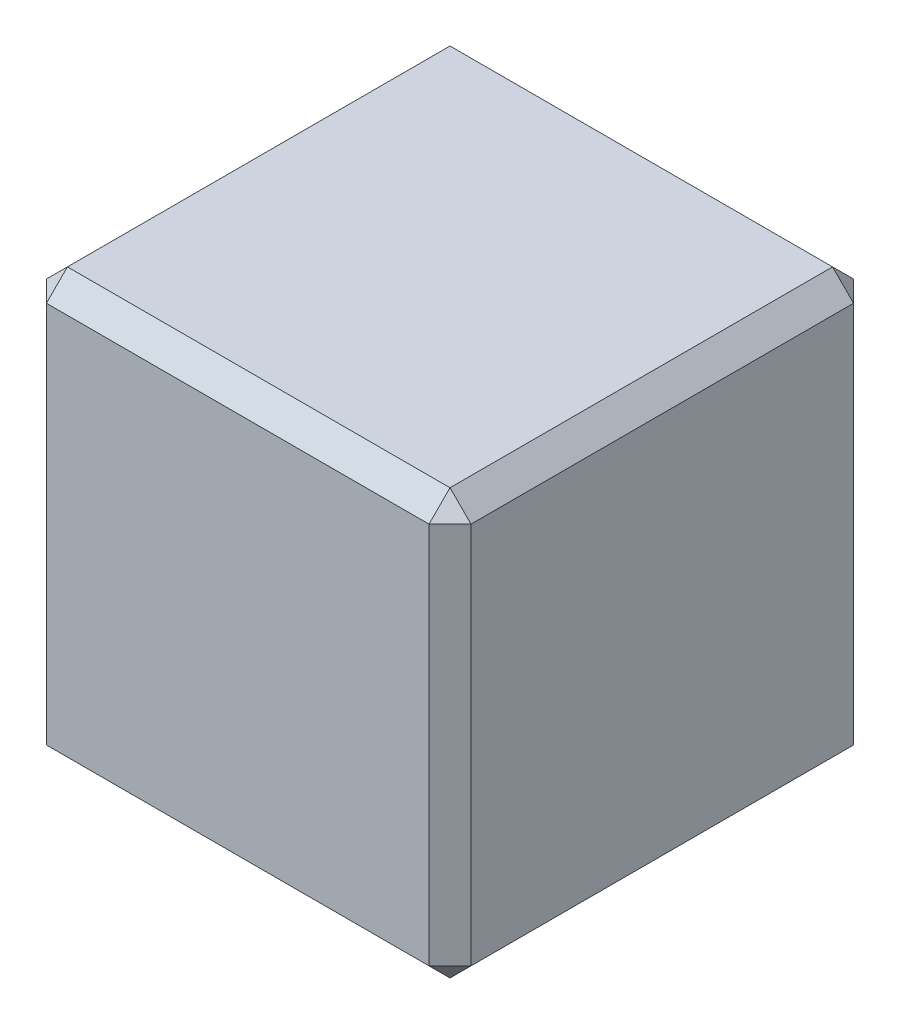
ISO-10303-21;
HEADER;
FILE_DESCRIPTION(('STEP AP214'),'2;1');
FILE_NAME('part.step','',(''),(''),'','','');
FILE_SCHEMA(('AUTOMOTIVE_DESIGN { 1 0 10303 214 1 1 1 1 }'));
ENDSEC;
DATA;
#1=APPLICATION_CONTEXT('core data for automotive mechanical design processes');
#2=APPLICATION_PROTOCOL_DEFINITION('international standard','automotive_design',2000,#1);
#3=PRODUCT_CONTEXT('',#1,'mechanical');
#4=PRODUCT('Part','Part','',(#3));
#5=PRODUCT_RELATED_PRODUCT_CATEGORY('part','',(#4));
#6=PRODUCT_DEFINITION_FORMATION('','',#4);
#7=PRODUCT_DEFINITION_CONTEXT('part definition',#1,'design');
#8=PRODUCT_DEFINITION('design','',#6,#7);
#9=PRODUCT_DEFINITION_SHAPE('','',#8);
#10=(LENGTH_UNIT() NAMED_UNIT(*) SI_UNIT(.MILLI.,.METRE.));
#11=(NAMED_UNIT(*) PLANE_ANGLE_UNIT() SI_UNIT($,.RADIAN.));
#12=(NAMED_UNIT(*) SI_UNIT($,.STERADIAN.) SOLID_ANGLE_UNIT());
#13=UNCERTAINTY_MEASURE_WITH_UNIT(LENGTH_MEASURE(1.E-05),#10,'distance_accuracy_value','');
#14=(GEOMETRIC_REPRESENTATION_CONTEXT(3) GLOBAL_UNCERTAINTY_ASSIGNED_CONTEXT((#13)) GLOBAL_UNIT_ASSIGNED_CONTEXT((#10,
#11,#12)) REPRESENTATION_CONTEXT('',''));
#15=CARTESIAN_POINT('',(0.,0.,0.));
#16=DIRECTION('',(0.,0.,1.));
#17=DIRECTION('',(1.,0.,0.));
#18=AXIS2_PLACEMENT_3D('',#15,#16,#17);
#19=CARTESIAN_POINT('',(50.54,101.08,-50.54));
#20=DIRECTION('',(-1.,0.,0.));
#21=DIRECTION('',(0.,0.,1.));
#22=AXIS2_PLACEMENT_3D('',#19,#20,#21);
#23=PLANE('',#22);
#24=DIRECTION('',(0.,-1.,0.));
#25=VECTOR('',#24,1.);
#26=CARTESIAN_POINT('',(50.54,101.08,45.54));
#27=LINE('',#26,#25);
#28=CARTESIAN_POINT('',(50.54,96.08,45.54));
#29=VERTEX_POINT('',#28);
#30=CARTESIAN_POINT('',(50.54,4.99999999999999,45.54));
#31=VERTEX_POINT('',#30);
#32=EDGE_CURVE('E128',#29,#31,#27,.T.);
#33=ORIENTED_EDGE('',*,*,#32,.T.);
#34=DIRECTION('',(0.,0.,-1.));
#35=VECTOR('',#34,1.);
#36=CARTESIAN_POINT('',(50.54,4.99999999999999,-50.54));
#37=LINE('',#36,#35);
#38=CARTESIAN_POINT('',(50.54,4.99999999999999,-45.54));
#39=VERTEX_POINT('',#38);
#40=EDGE_CURVE('E165',#31,#39,#37,.T.);
#41=ORIENTED_EDGE('',*,*,#40,.T.);
#42=DIRECTION('',(0.,1.,0.));
#43=VECTOR('',#42,1.);
#44=CARTESIAN_POINT('',(50.54,101.08,-45.54));
#45=LINE('',#44,#43);
#46=CARTESIAN_POINT('',(50.54,96.08,-45.54));
#47=VERTEX_POINT('',#46);
#48=EDGE_CURVE('E131',#39,#47,#45,.T.);
#49=ORIENTED_EDGE('',*,*,#48,.T.);
#50=DIRECTION('',(0.,0.,1.));
#51=VECTOR('',#50,1.);
#52=CARTESIAN_POINT('',(50.54,96.08,50.54));
#53=LINE('',#52,#51);
#54=EDGE_CURVE('E124',#47,#29,#53,.T.);
#55=ORIENTED_EDGE('',*,*,#54,.T.);
#56=EDGE_LOOP('',(#33,#41,#49,#55));
#57=FACE_BOUND('',#56,.T.);
#58=ADVANCED_FACE('F37',(#57),#23,.F.);
#59=CARTESIAN_POINT('',(-50.54,101.08,-50.54));
#60=DIRECTION('',(0.,0.,1.));
#61=DIRECTION('',(1.,0.,0.));
#62=AXIS2_PLACEMENT_3D('',#59,#60,#61);
#63=PLANE('',#62);
#64=DIRECTION('',(1.,0.,0.));
#65=VECTOR('',#64,1.);
#66=CARTESIAN_POINT('',(50.54,96.08,-50.54));
#67=LINE('',#66,#65);
#68=CARTESIAN_POINT('',(-45.54,96.08,-50.54));
#69=VERTEX_POINT('',#68);
#70=CARTESIAN_POINT('',(45.54,96.08,-50.54));
#71=VERTEX_POINT('',#70);
#72=EDGE_CURVE('E178',#69,#71,#67,.T.);
#73=ORIENTED_EDGE('',*,*,#72,.T.);
#74=DIRECTION('',(0.,-1.,0.));
#75=VECTOR('',#74,1.);
#76=CARTESIAN_POINT('',(45.54,101.08,-50.54));
#77=LINE('',#76,#75);
#78=CARTESIAN_POINT('',(45.54,4.99999999999999,-50.54));
#79=VERTEX_POINT('',#78);
#80=EDGE_CURVE('E182',#71,#79,#77,.T.);
#81=ORIENTED_EDGE('',*,*,#80,.T.);
#82=DIRECTION('',(-1.,0.,0.));
#83=VECTOR('',#82,1.);
#84=CARTESIAN_POINT('',(-50.54,4.99999999999999,-50.54));
#85=LINE('',#84,#83);
#86=CARTESIAN_POINT('',(-45.54,4.99999999999999,-50.54));
#87=VERTEX_POINT('',#86);
#88=EDGE_CURVE('E180',#79,#87,#85,.T.);
#89=ORIENTED_EDGE('',*,*,#88,.T.);
#90=DIRECTION('',(0.,1.,0.));
#91=VECTOR('',#90,1.);
#92=CARTESIAN_POINT('',(-45.54,101.08,-50.54));
#93=LINE('',#92,#91);
#94=EDGE_CURVE('E176',#87,#69,#93,.T.);
#95=ORIENTED_EDGE('',*,*,#94,.T.);
#96=EDGE_LOOP('',(#73,#81,#89,#95));
#97=FACE_BOUND('',#96,.T.);
#98=ADVANCED_FACE('F278',(#97),#63,.F.);
#99=CARTESIAN_POINT('',(-50.54,101.08,-50.54));
#100=DIRECTION('',(1.,0.,0.));
#101=DIRECTION('',(0.,0.,-1.));
#102=AXIS2_PLACEMENT_3D('',#99,#100,#101);
#103=PLANE('',#102);
#104=DIRECTION('',(0.,0.,-1.));
#105=VECTOR('',#104,1.);
#106=CARTESIAN_POINT('',(-50.54,96.08,-50.54));
#107=LINE('',#106,#105);
#108=CARTESIAN_POINT('',(-50.54,96.08,45.54));
#109=VERTEX_POINT('',#108);
#110=CARTESIAN_POINT('',(-50.54,96.08,-45.54));
#111=VERTEX_POINT('',#110);
#112=EDGE_CURVE('E46',#109,#111,#107,.T.);
#113=ORIENTED_EDGE('',*,*,#112,.T.);
#114=DIRECTION('',(0.,-1.,0.));
#115=VECTOR('',#114,1.);
#116=CARTESIAN_POINT('',(-50.54,101.08,-45.54));
#117=LINE('',#116,#115);
#118=CARTESIAN_POINT('',(-50.54,4.99999999999999,-45.54));
#119=VERTEX_POINT('',#118);
#120=EDGE_CURVE('E11',#111,#119,#117,.T.);
#121=ORIENTED_EDGE('',*,*,#120,.T.);
#122=DIRECTION('',(0.,0.,1.));
#123=VECTOR('',#122,1.);
#124=CARTESIAN_POINT('',(-50.54,4.99999999999999,-50.54));
#125=LINE('',#124,#123);
#126=CARTESIAN_POINT('',(-50.54,4.99999999999999,45.54));
#127=VERTEX_POINT('',#126);
#128=EDGE_CURVE('E202',#119,#127,#125,.T.);
#129=ORIENTED_EDGE('',*,*,#128,.T.);
#130=DIRECTION('',(0.,1.,0.));
#131=VECTOR('',#130,1.);
#132=CARTESIAN_POINT('',(-50.54,101.08,45.54));
#133=LINE('',#132,#131);
#134=EDGE_CURVE('E57',#127,#109,#133,.T.);
#135=ORIENTED_EDGE('',*,*,#134,.T.);
#136=EDGE_LOOP('',(#113,#121,#129,#135));
#137=FACE_BOUND('',#136,.T.);
#138=ADVANCED_FACE('F284',(#137),#103,.F.);
#139=CARTESIAN_POINT('',(-50.54,101.08,50.54));
#140=DIRECTION('',(0.,0.,-1.));
#141=DIRECTION('',(-1.,0.,0.));
#142=AXIS2_PLACEMENT_3D('',#139,#140,#141);
#143=PLANE('',#142);
#144=DIRECTION('',(0.,1.,0.));
#145=VECTOR('',#144,1.);
#146=CARTESIAN_POINT('',(45.54,101.08,50.54));
#147=LINE('',#146,#145);
#148=CARTESIAN_POINT('',(45.54,4.99999999999999,50.54));
#149=VERTEX_POINT('',#148);
#150=CARTESIAN_POINT('',(45.54,96.08,50.54));
#151=VERTEX_POINT('',#150);
#152=EDGE_CURVE('E197',#149,#151,#147,.T.);
#153=ORIENTED_EDGE('',*,*,#152,.T.);
#154=DIRECTION('',(-1.,0.,0.));
#155=VECTOR('',#154,1.);
#156=CARTESIAN_POINT('',(-50.54,96.08,50.54));
#157=LINE('',#156,#155);
#158=CARTESIAN_POINT('',(-45.54,96.08,50.54));
#159=VERTEX_POINT('',#158);
#160=EDGE_CURVE('E199',#151,#159,#157,.T.);
#161=ORIENTED_EDGE('',*,*,#160,.T.);
#162=DIRECTION('',(0.,-1.,0.));
#163=VECTOR('',#162,1.);
#164=CARTESIAN_POINT('',(-45.54,101.08,50.54));
#165=LINE('',#164,#163);
#166=CARTESIAN_POINT('',(-45.54,4.99999999999999,50.54));
#167=VERTEX_POINT('',#166);
#168=EDGE_CURVE('E193',#159,#167,#165,.T.);
#169=ORIENTED_EDGE('',*,*,#168,.T.);
#170=DIRECTION('',(1.,0.,0.));
#171=VECTOR('',#170,1.);
#172=CARTESIAN_POINT('',(-50.54,4.99999999999999,50.54));
#173=LINE('',#172,#171);
#174=EDGE_CURVE('E195',#167,#149,#173,.T.);
#175=ORIENTED_EDGE('',*,*,#174,.T.);
#176=EDGE_LOOP('',(#153,#161,#169,#175));
#177=FACE_BOUND('',#176,.T.);
#178=ADVANCED_FACE('F303',(#177),#143,.F.);
#179=CARTESIAN_POINT('',(0.,101.08,0.));
#180=DIRECTION('',(0.,1.,0.));
#181=DIRECTION('',(0.,0.,1.));
#182=AXIS2_PLACEMENT_3D('',#179,#180,#181);
#183=PLANE('',#182);
#184=DIRECTION('',(0.,0.,-1.));
#185=VECTOR('',#184,1.);
#186=CARTESIAN_POINT('',(45.54,101.08,-50.54));
#187=LINE('',#186,#185);
#188=CARTESIAN_POINT('',(45.54,101.08,45.54));
#189=VERTEX_POINT('',#188);
#190=CARTESIAN_POINT('',(45.54,101.08,-45.54));
#191=VERTEX_POINT('',#190);
#192=EDGE_CURVE('E141',#189,#191,#187,.T.);
#193=ORIENTED_EDGE('',*,*,#192,.T.);
#194=DIRECTION('',(-1.,0.,0.));
#195=VECTOR('',#194,1.);
#196=CARTESIAN_POINT('',(-50.54,101.08,-45.54));
#197=LINE('',#196,#195);
#198=CARTESIAN_POINT('',(-45.54,101.08,-45.54));
#199=VERTEX_POINT('',#198);
#200=EDGE_CURVE('E190',#191,#199,#197,.T.);
#201=ORIENTED_EDGE('',*,*,#200,.T.);
#202=DIRECTION('',(0.,0.,1.));
#203=VECTOR('',#202,1.);
#204=CARTESIAN_POINT('',(-45.54,101.08,50.54));
#205=LINE('',#204,#203);
#206=CARTESIAN_POINT('',(-45.54,101.08,45.54));
#207=VERTEX_POINT('',#206);
#208=EDGE_CURVE('E185',#199,#207,#205,.T.);
#209=ORIENTED_EDGE('',*,*,#208,.T.);
#210=DIRECTION('',(1.,0.,0.));
#211=VECTOR('',#210,1.);
#212=CARTESIAN_POINT('',(50.54,101.08,45.54));
#213=LINE('',#212,#211);
#214=EDGE_CURVE('E187',#207,#189,#213,.T.);
#215=ORIENTED_EDGE('',*,*,#214,.T.);
#216=EDGE_LOOP('',(#193,#201,#209,#215));
#217=FACE_BOUND('',#216,.T.);
#218=ADVANCED_FACE('F265',(#217),#183,.T.);
#219=CARTESIAN_POINT('',(0.,0.,0.));
#220=DIRECTION('',(0.,1.,0.));
#221=DIRECTION('',(0.,0.,1.));
#222=AXIS2_PLACEMENT_3D('',#219,#220,#221);
#223=PLANE('',#222);
#224=DIRECTION('',(1.,0.,0.));
#225=VECTOR('',#224,1.);
#226=CARTESIAN_POINT('',(0.,0.,-45.54));
#227=LINE('',#226,#225);
#228=CARTESIAN_POINT('',(-45.54,0.,-45.54));
#229=VERTEX_POINT('',#228);
#230=CARTESIAN_POINT('',(45.54,0.,-45.54));
#231=VERTEX_POINT('',#230);
#232=EDGE_CURVE('E171',#229,#231,#227,.T.);
#233=ORIENTED_EDGE('',*,*,#232,.T.);
#234=DIRECTION('',(0.,0.,1.));
#235=VECTOR('',#234,1.);
#236=CARTESIAN_POINT('',(45.54,0.,0.));
#237=LINE('',#236,#235);
#238=CARTESIAN_POINT('',(45.54,0.,45.54));
#239=VERTEX_POINT('',#238);
#240=EDGE_CURVE('E173',#231,#239,#237,.T.);
#241=ORIENTED_EDGE('',*,*,#240,.T.);
#242=DIRECTION('',(-1.,0.,0.));
#243=VECTOR('',#242,1.);
#244=CARTESIAN_POINT('',(0.,0.,45.54));
#245=LINE('',#244,#243);
#246=CARTESIAN_POINT('',(-45.54,0.,45.54));
#247=VERTEX_POINT('',#246);
#248=EDGE_CURVE('E169',#239,#247,#245,.T.);
#249=ORIENTED_EDGE('',*,*,#248,.T.);
#250=DIRECTION('',(0.,0.,-1.));
#251=VECTOR('',#250,1.);
#252=CARTESIAN_POINT('',(-45.54,0.,0.));
#253=LINE('',#252,#251);
#254=EDGE_CURVE('E167',#247,#229,#253,.T.);
#255=ORIENTED_EDGE('',*,*,#254,.T.);
#256=EDGE_LOOP('',(#233,#241,#249,#255));
#257=FACE_BOUND('',#256,.T.);
#258=ADVANCED_FACE('F481',(#257),#223,.F.);
#259=CARTESIAN_POINT('',(-45.54,101.08,0.));
#260=DIRECTION('',(-0.707106781186546,0.707106781186548,0.));
#261=DIRECTION('',(0.,0.,-1.));
#262=AXIS2_PLACEMENT_3D('',#259,#260,#261);
#263=PLANE('',#262);
#264=DIRECTION('',(-0.707106781186548,-0.707106781186546,0.));
#265=VECTOR('',#264,1.);
#266=CARTESIAN_POINT('',(-48.04,98.58,45.54));
#267=LINE('',#266,#265);
#268=EDGE_CURVE('E41',#207,#109,#267,.T.);
#269=ORIENTED_EDGE('',*,*,#268,.F.);
#270=ORIENTED_EDGE('',*,*,#208,.F.);
#271=DIRECTION('',(0.707106781186548,0.707106781186546,0.));
#272=VECTOR('',#271,1.);
#273=CARTESIAN_POINT('',(-45.54,101.08,-45.54));
#274=LINE('',#273,#272);
#275=EDGE_CURVE('E162',#111,#199,#274,.T.);
#276=ORIENTED_EDGE('',*,*,#275,.F.);
#277=ORIENTED_EDGE('',*,*,#112,.F.);
#278=EDGE_LOOP('',(#269,#270,#276,#277));
#279=FACE_BOUND('',#278,.T.);
#280=ADVANCED_FACE('F39',(#279),#263,.T.);
#281=CARTESIAN_POINT('',(-45.54,96.08,50.54));
#282=DIRECTION('',(-0.577350269189624,0.577350269189626,0.577350269189627));
#283=DIRECTION('',(0.,-0.707106781186548,0.707106781186547));
#284=AXIS2_PLACEMENT_3D('',#281,#282,#283);
#285=PLANE('',#284);
#286=DIRECTION('',(0.,0.707106781186548,-0.707106781186546));
#287=VECTOR('',#286,1.);
#288=CARTESIAN_POINT('',(-45.54,96.08,50.54));
#289=LINE('',#288,#287);
#290=EDGE_CURVE('E247',#207,#159,#289,.F.);
#291=ORIENTED_EDGE('',*,*,#290,.F.);
#292=ORIENTED_EDGE('',*,*,#268,.T.);
#293=DIRECTION('',(-0.707106781186548,0.,-0.707106781186546));
#294=VECTOR('',#293,1.);
#295=CARTESIAN_POINT('',(-45.54,96.08,50.54));
#296=LINE('',#295,#294);
#297=EDGE_CURVE('E250',#159,#109,#296,.T.);
#298=ORIENTED_EDGE('',*,*,#297,.F.);
#299=EDGE_LOOP('',(#291,#292,#298));
#300=FACE_BOUND('',#299,.T.);
#301=ADVANCED_FACE('F306',(#300),#285,.T.);
#302=CARTESIAN_POINT('',(-45.54,101.08,-45.54));
#303=DIRECTION('',(-0.577350269189624,0.577350269189626,-0.577350269189627));
#304=DIRECTION('',(0.,0.707106781186548,0.707106781186547));
#305=AXIS2_PLACEMENT_3D('',#302,#303,#304);
#306=PLANE('',#305);
#307=DIRECTION('',(0.707106781186548,0.,-0.707106781186546));
#308=VECTOR('',#307,1.);
#309=CARTESIAN_POINT('',(-48.04,96.08,-48.04));
#310=LINE('',#309,#308);
#311=EDGE_CURVE('E242',#111,#69,#310,.T.);
#312=ORIENTED_EDGE('',*,*,#311,.F.);
#313=ORIENTED_EDGE('',*,*,#275,.T.);
#314=DIRECTION('',(0.,-0.707106781186548,-0.707106781186546));
#315=VECTOR('',#314,1.);
#316=CARTESIAN_POINT('',(-45.54,101.08,-45.54));
#317=LINE('',#316,#315);
#318=EDGE_CURVE('E245',#69,#199,#317,.F.);
#319=ORIENTED_EDGE('',*,*,#318,.F.);
#320=EDGE_LOOP('',(#312,#313,#319));
#321=FACE_BOUND('',#320,.T.);
#322=ADVANCED_FACE('F257',(#321),#306,.T.);
#323=CARTESIAN_POINT('',(-45.54,101.08,50.54));
#324=DIRECTION('',(0.707106781186546,0.,-0.707106781186548));
#325=DIRECTION('',(0.,-1.,0.));
#326=AXIS2_PLACEMENT_3D('',#323,#324,#325);
#327=PLANE('',#326);
#328=ORIENTED_EDGE('',*,*,#297,.T.);
#329=ORIENTED_EDGE('',*,*,#134,.F.);
#330=DIRECTION('',(0.707106781186548,0.,0.707106781186546));
#331=VECTOR('',#330,1.);
#332=CARTESIAN_POINT('',(-48.04,4.99999999999999,48.04));
#333=LINE('',#332,#331);
#334=EDGE_CURVE('E236',#167,#127,#333,.F.);
#335=ORIENTED_EDGE('',*,*,#334,.F.);
#336=ORIENTED_EDGE('',*,*,#168,.F.);
#337=EDGE_LOOP('',(#328,#329,#335,#336));
#338=FACE_BOUND('',#337,.T.);
#339=ADVANCED_FACE('F290',(#338),#327,.F.);
#340=CARTESIAN_POINT('',(0.,101.08,45.54));
#341=DIRECTION('',(0.,0.707106781186546,0.707106781186548));
#342=DIRECTION('',(-1.,0.,0.));
#343=AXIS2_PLACEMENT_3D('',#340,#341,#342);
#344=PLANE('',#343);
#345=ORIENTED_EDGE('',*,*,#290,.T.);
#346=ORIENTED_EDGE('',*,*,#160,.F.);
#347=DIRECTION('',(0.,-0.707106781186548,0.707106781186546));
#348=VECTOR('',#347,1.);
#349=CARTESIAN_POINT('',(45.54,98.58,48.04));
#350=LINE('',#349,#348);
#351=EDGE_CURVE('E145',#189,#151,#350,.T.);
#352=ORIENTED_EDGE('',*,*,#351,.F.);
#353=ORIENTED_EDGE('',*,*,#214,.F.);
#354=EDGE_LOOP('',(#345,#346,#352,#353));
#355=FACE_BOUND('',#354,.T.);
#356=ADVANCED_FACE('F309',(#355),#344,.T.);
#357=CARTESIAN_POINT('',(45.54,101.08,0.));
#358=DIRECTION('',(0.707106781186548,0.707106781186546,0.));
#359=DIRECTION('',(0.,0.,1.));
#360=AXIS2_PLACEMENT_3D('',#357,#358,#359);
#361=PLANE('',#360);
#362=DIRECTION('',(0.707106781186546,-0.707106781186548,0.));
#363=VECTOR('',#362,1.);
#364=CARTESIAN_POINT('',(50.54,96.08,-45.54));
#365=LINE('',#364,#363);
#366=EDGE_CURVE('E146',#191,#47,#365,.T.);
#367=ORIENTED_EDGE('',*,*,#366,.F.);
#368=ORIENTED_EDGE('',*,*,#192,.F.);
#369=DIRECTION('',(-0.707106781186546,0.707106781186548,0.));
#370=VECTOR('',#369,1.);
#371=CARTESIAN_POINT('',(50.54,96.08,45.54));
#372=LINE('',#371,#370);
#373=EDGE_CURVE('E138',#29,#189,#372,.T.);
#374=ORIENTED_EDGE('',*,*,#373,.F.);
#375=ORIENTED_EDGE('',*,*,#54,.F.);
#376=EDGE_LOOP('',(#367,#368,#374,#375));
#377=FACE_BOUND('',#376,.T.);
#378=ADVANCED_FACE('F140',(#377),#361,.T.);
#379=CARTESIAN_POINT('',(0.,101.08,-45.54));
#380=DIRECTION('',(0.,0.707106781186546,-0.707106781186548));
#381=DIRECTION('',(1.,0.,0.));
#382=AXIS2_PLACEMENT_3D('',#379,#380,#381);
#383=PLANE('',#382);
#384=ORIENTED_EDGE('',*,*,#318,.T.);
#385=ORIENTED_EDGE('',*,*,#200,.F.);
#386=DIRECTION('',(0.,0.707106781186548,0.707106781186546));
#387=VECTOR('',#386,1.);
#388=CARTESIAN_POINT('',(45.54,98.58,-48.04));
#389=LINE('',#388,#387);
#390=EDGE_CURVE('E231',#71,#191,#389,.T.);
#391=ORIENTED_EDGE('',*,*,#390,.F.);
#392=ORIENTED_EDGE('',*,*,#72,.F.);
#393=EDGE_LOOP('',(#384,#385,#391,#392));
#394=FACE_BOUND('',#393,.T.);
#395=ADVANCED_FACE('F268',(#394),#383,.T.);
#396=CARTESIAN_POINT('',(-50.54,101.08,-45.54));
#397=DIRECTION('',(0.707106781186546,0.,0.707106781186548));
#398=DIRECTION('',(0.,-1.,0.));
#399=AXIS2_PLACEMENT_3D('',#396,#397,#398);
#400=PLANE('',#399);
#401=ORIENTED_EDGE('',*,*,#311,.T.);
#402=ORIENTED_EDGE('',*,*,#94,.F.);
#403=DIRECTION('',(-0.707106781186548,0.,0.707106781186546));
#404=VECTOR('',#403,1.);
#405=CARTESIAN_POINT('',(-45.54,4.99999999999999,-50.54));
#406=LINE('',#405,#404);
#407=EDGE_CURVE('E228',#119,#87,#406,.F.);
#408=ORIENTED_EDGE('',*,*,#407,.F.);
#409=ORIENTED_EDGE('',*,*,#120,.F.);
#410=EDGE_LOOP('',(#401,#402,#408,#409));
#411=FACE_BOUND('',#410,.T.);
#412=ADVANCED_FACE('F282',(#411),#400,.F.);
#413=CARTESIAN_POINT('',(-50.54,4.99999999999999,-50.54));
#414=DIRECTION('',(0.707106781186546,0.707106781186548,0.));
#415=DIRECTION('',(0.,0.,1.));
#416=AXIS2_PLACEMENT_3D('',#413,#414,#415);
#417=PLANE('',#416);
#418=DIRECTION('',(-0.707106781186548,0.707106781186546,0.));
#419=VECTOR('',#418,1.);
#420=CARTESIAN_POINT('',(-45.54,0.,45.54));
#421=LINE('',#420,#419);
#422=EDGE_CURVE('E239',#127,#247,#421,.F.);
#423=ORIENTED_EDGE('',*,*,#422,.F.);
#424=ORIENTED_EDGE('',*,*,#128,.F.);
#425=DIRECTION('',(0.707106781186548,-0.707106781186546,0.));
#426=VECTOR('',#425,1.);
#427=CARTESIAN_POINT('',(-48.04,2.49999999999999,-45.54));
#428=LINE('',#427,#426);
#429=EDGE_CURVE('E226',#229,#119,#428,.F.);
#430=ORIENTED_EDGE('',*,*,#429,.F.);
#431=ORIENTED_EDGE('',*,*,#254,.F.);
#432=EDGE_LOOP('',(#423,#424,#430,#431));
#433=FACE_BOUND('',#432,.T.);
#434=ADVANCED_FACE('F294',(#433),#417,.F.);
#435=CARTESIAN_POINT('',(-45.54,0.,45.54));
#436=DIRECTION('',(-0.577350269189624,-0.577350269189627,0.577350269189626));
#437=DIRECTION('',(0.,-0.707106781186547,-0.707106781186548));
#438=AXIS2_PLACEMENT_3D('',#435,#436,#437);
#439=PLANE('',#438);
#440=ORIENTED_EDGE('',*,*,#334,.T.);
#441=ORIENTED_EDGE('',*,*,#422,.T.);
#442=DIRECTION('',(0.,-0.707106781186546,-0.707106781186548));
#443=VECTOR('',#442,1.);
#444=CARTESIAN_POINT('',(-45.54,0.,45.54));
#445=LINE('',#444,#443);
#446=EDGE_CURVE('E153',#167,#247,#445,.T.);
#447=ORIENTED_EDGE('',*,*,#446,.F.);
#448=EDGE_LOOP('',(#440,#441,#447));
#449=FACE_BOUND('',#448,.T.);
#450=ADVANCED_FACE('F296',(#449),#439,.T.);
#451=CARTESIAN_POINT('',(50.54,96.08,45.54));
#452=DIRECTION('',(0.577350269189626,0.577350269189624,0.577350269189627));
#453=DIRECTION('',(0.707106781186548,0.,-0.707106781186547));
#454=AXIS2_PLACEMENT_3D('',#451,#452,#453);
#455=PLANE('',#454);
#456=ORIENTED_EDGE('',*,*,#373,.T.);
#457=ORIENTED_EDGE('',*,*,#351,.T.);
#458=DIRECTION('',(-0.707106781186548,0.,0.707106781186546));
#459=VECTOR('',#458,1.);
#460=CARTESIAN_POINT('',(50.54,96.08,45.54));
#461=LINE('',#460,#459);
#462=EDGE_CURVE('E149',#29,#151,#461,.T.);
#463=ORIENTED_EDGE('',*,*,#462,.F.);
#464=EDGE_LOOP('',(#456,#457,#463));
#465=FACE_BOUND('',#464,.T.);
#466=ADVANCED_FACE('F150',(#465),#455,.T.);
#467=CARTESIAN_POINT('',(50.54,96.08,-45.54));
#468=DIRECTION('',(0.577350269189627,0.577350269189624,-0.577350269189626));
#469=DIRECTION('',(-0.707106781186547,0.,-0.707106781186548));
#470=AXIS2_PLACEMENT_3D('',#467,#468,#469);
#471=PLANE('',#470);
#472=ORIENTED_EDGE('',*,*,#390,.T.);
#473=ORIENTED_EDGE('',*,*,#366,.T.);
#474=DIRECTION('',(0.707106781186546,0.,0.707106781186548));
#475=VECTOR('',#474,1.);
#476=CARTESIAN_POINT('',(50.54,96.08,-45.54));
#477=LINE('',#476,#475);
#478=EDGE_CURVE('E154',#71,#47,#477,.T.);
#479=ORIENTED_EDGE('',*,*,#478,.F.);
#480=EDGE_LOOP('',(#472,#473,#479));
#481=FACE_BOUND('',#480,.T.);
#482=ADVANCED_FACE('F271',(#481),#471,.T.);
#483=CARTESIAN_POINT('',(-45.54,4.99999999999999,-50.54));
#484=DIRECTION('',(-0.577350269189624,-0.577350269189627,-0.577350269189626));
#485=DIRECTION('',(0.,0.707106781186547,-0.707106781186548));
#486=AXIS2_PLACEMENT_3D('',#483,#484,#485);
#487=PLANE('',#486);
#488=ORIENTED_EDGE('',*,*,#429,.T.);
#489=ORIENTED_EDGE('',*,*,#407,.T.);
#490=DIRECTION('',(0.,0.707106781186546,-0.707106781186548));
#491=VECTOR('',#490,1.);
#492=CARTESIAN_POINT('',(-45.54,4.99999999999999,-50.54));
#493=LINE('',#492,#491);
#494=EDGE_CURVE('E219',#229,#87,#493,.T.);
#495=ORIENTED_EDGE('',*,*,#494,.F.);
#496=EDGE_LOOP('',(#488,#489,#495));
#497=FACE_BOUND('',#496,.T.);
#498=ADVANCED_FACE('F348',(#497),#487,.T.);
#499=CARTESIAN_POINT('',(-50.54,4.99999999999999,50.54));
#500=DIRECTION('',(0.,0.707106781186548,-0.707106781186546));
#501=DIRECTION('',(1.,0.,0.));
#502=AXIS2_PLACEMENT_3D('',#499,#500,#501);
#503=PLANE('',#502);
#504=ORIENTED_EDGE('',*,*,#446,.T.);
#505=ORIENTED_EDGE('',*,*,#248,.F.);
#506=DIRECTION('',(0.,0.707106781186546,0.707106781186548));
#507=VECTOR('',#506,1.);
#508=CARTESIAN_POINT('',(45.54,0.,45.54));
#509=LINE('',#508,#507);
#510=EDGE_CURVE('E216',#149,#239,#509,.F.);
#511=ORIENTED_EDGE('',*,*,#510,.F.);
#512=ORIENTED_EDGE('',*,*,#174,.F.);
#513=EDGE_LOOP('',(#504,#505,#511,#512));
#514=FACE_BOUND('',#513,.T.);
#515=ADVANCED_FACE('F301',(#514),#503,.F.);
#516=CARTESIAN_POINT('',(50.54,101.08,45.54));
#517=DIRECTION('',(-0.707106781186546,0.,-0.707106781186548));
#518=DIRECTION('',(0.,-1.,0.));
#519=AXIS2_PLACEMENT_3D('',#516,#517,#518);
#520=PLANE('',#519);
#521=ORIENTED_EDGE('',*,*,#462,.T.);
#522=ORIENTED_EDGE('',*,*,#152,.F.);
#523=DIRECTION('',(0.707106781186548,0.,-0.707106781186546));
#524=VECTOR('',#523,1.);
#525=CARTESIAN_POINT('',(48.04,4.99999999999999,48.04));
#526=LINE('',#525,#524);
#527=EDGE_CURVE('E158',#31,#149,#526,.F.);
#528=ORIENTED_EDGE('',*,*,#527,.F.);
#529=ORIENTED_EDGE('',*,*,#32,.F.);
#530=EDGE_LOOP('',(#521,#522,#528,#529));
#531=FACE_BOUND('',#530,.T.);
#532=ADVANCED_FACE('F156',(#531),#520,.F.);
#533=CARTESIAN_POINT('',(45.54,101.08,-50.54));
#534=DIRECTION('',(-0.707106781186548,0.,0.707106781186546));
#535=DIRECTION('',(0.,-1.,0.));
#536=AXIS2_PLACEMENT_3D('',#533,#534,#535);
#537=PLANE('',#536);
#538=ORIENTED_EDGE('',*,*,#478,.T.);
#539=ORIENTED_EDGE('',*,*,#48,.F.);
#540=DIRECTION('',(-0.707106781186546,0.,-0.707106781186548));
#541=VECTOR('',#540,1.);
#542=CARTESIAN_POINT('',(50.54,4.99999999999999,-45.54));
#543=LINE('',#542,#541);
#544=EDGE_CURVE('E212',#79,#39,#543,.F.);
#545=ORIENTED_EDGE('',*,*,#544,.F.);
#546=ORIENTED_EDGE('',*,*,#80,.F.);
#547=EDGE_LOOP('',(#538,#539,#545,#546));
#548=FACE_BOUND('',#547,.T.);
#549=ADVANCED_FACE('F275',(#548),#537,.F.);
#550=CARTESIAN_POINT('',(-50.54,4.99999999999999,-50.54));
#551=DIRECTION('',(0.,0.707106781186548,0.707106781186546));
#552=DIRECTION('',(-1.,0.,0.));
#553=AXIS2_PLACEMENT_3D('',#550,#551,#552);
#554=PLANE('',#553);
#555=ORIENTED_EDGE('',*,*,#494,.T.);
#556=ORIENTED_EDGE('',*,*,#88,.F.);
#557=DIRECTION('',(0.,-0.707106781186546,0.707106781186548));
#558=VECTOR('',#557,1.);
#559=CARTESIAN_POINT('',(45.54,2.49999999999999,-48.04));
#560=LINE('',#559,#558);
#561=EDGE_CURVE('E210',#231,#79,#560,.F.);
#562=ORIENTED_EDGE('',*,*,#561,.F.);
#563=ORIENTED_EDGE('',*,*,#232,.F.);
#564=EDGE_LOOP('',(#555,#556,#562,#563));
#565=FACE_BOUND('',#564,.T.);
#566=ADVANCED_FACE('F337',(#565),#554,.F.);
#567=CARTESIAN_POINT('',(45.54,0.,45.54));
#568=DIRECTION('',(0.577350269189624,-0.577350269189627,0.577350269189626));
#569=DIRECTION('',(0.,-0.707106781186547,-0.707106781186548));
#570=AXIS2_PLACEMENT_3D('',#567,#568,#569);
#571=PLANE('',#570);
#572=ORIENTED_EDGE('',*,*,#527,.T.);
#573=ORIENTED_EDGE('',*,*,#510,.T.);
#574=DIRECTION('',(-0.707106781186548,-0.707106781186546,0.));
#575=VECTOR('',#574,1.);
#576=CARTESIAN_POINT('',(45.54,0.,45.54));
#577=LINE('',#576,#575);
#578=EDGE_CURVE('E208',#31,#239,#577,.T.);
#579=ORIENTED_EDGE('',*,*,#578,.F.);
#580=EDGE_LOOP('',(#572,#573,#579));
#581=FACE_BOUND('',#580,.T.);
#582=ADVANCED_FACE('F333',(#581),#571,.T.);
#583=CARTESIAN_POINT('',(50.54,4.99999999999999,-45.54));
#584=DIRECTION('',(0.577350269189626,-0.577350269189627,-0.577350269189624));
#585=DIRECTION('',(0.707106781186548,0.707106781186547,0.));
#586=AXIS2_PLACEMENT_3D('',#583,#584,#585);
#587=PLANE('',#586);
#588=ORIENTED_EDGE('',*,*,#561,.T.);
#589=ORIENTED_EDGE('',*,*,#544,.T.);
#590=DIRECTION('',(0.707106781186548,0.707106781186546,0.));
#591=VECTOR('',#590,1.);
#592=CARTESIAN_POINT('',(50.54,4.99999999999999,-45.54));
#593=LINE('',#592,#591);
#594=EDGE_CURVE('E206',#231,#39,#593,.T.);
#595=ORIENTED_EDGE('',*,*,#594,.F.);
#596=EDGE_LOOP('',(#588,#589,#595));
#597=FACE_BOUND('',#596,.T.);
#598=ADVANCED_FACE('F329',(#597),#587,.T.);
#599=CARTESIAN_POINT('',(50.54,4.99999999999999,-50.54));
#600=DIRECTION('',(-0.707106781186546,0.707106781186548,0.));
#601=DIRECTION('',(0.,0.,-1.));
#602=AXIS2_PLACEMENT_3D('',#599,#600,#601);
#603=PLANE('',#602);
#604=ORIENTED_EDGE('',*,*,#578,.T.);
#605=ORIENTED_EDGE('',*,*,#240,.F.);
#606=ORIENTED_EDGE('',*,*,#594,.T.);
#607=ORIENTED_EDGE('',*,*,#40,.F.);
#608=EDGE_LOOP('',(#604,#605,#606,#607));
#609=FACE_BOUND('',#608,.T.);
#610=ADVANCED_FACE('F326',(#609),#603,.F.);
#611=CLOSED_SHELL('',(#58,#98,#138,#178,#218,#258,#280,#301,#322,#339,#356,#378,#395,#412,#434,
#450,#466,#482,#498,#515,#532,#549,#566,#582,#598,#610));
#612=MANIFOLD_SOLID_BREP('B2',#611);
#613=ADVANCED_BREP_SHAPE_REPRESENTATION('',(#18,#612),#14);
#614=SHAPE_DEFINITION_REPRESENTATION(#9,#613);
ENDSEC;
END-ISO-10303-21;
